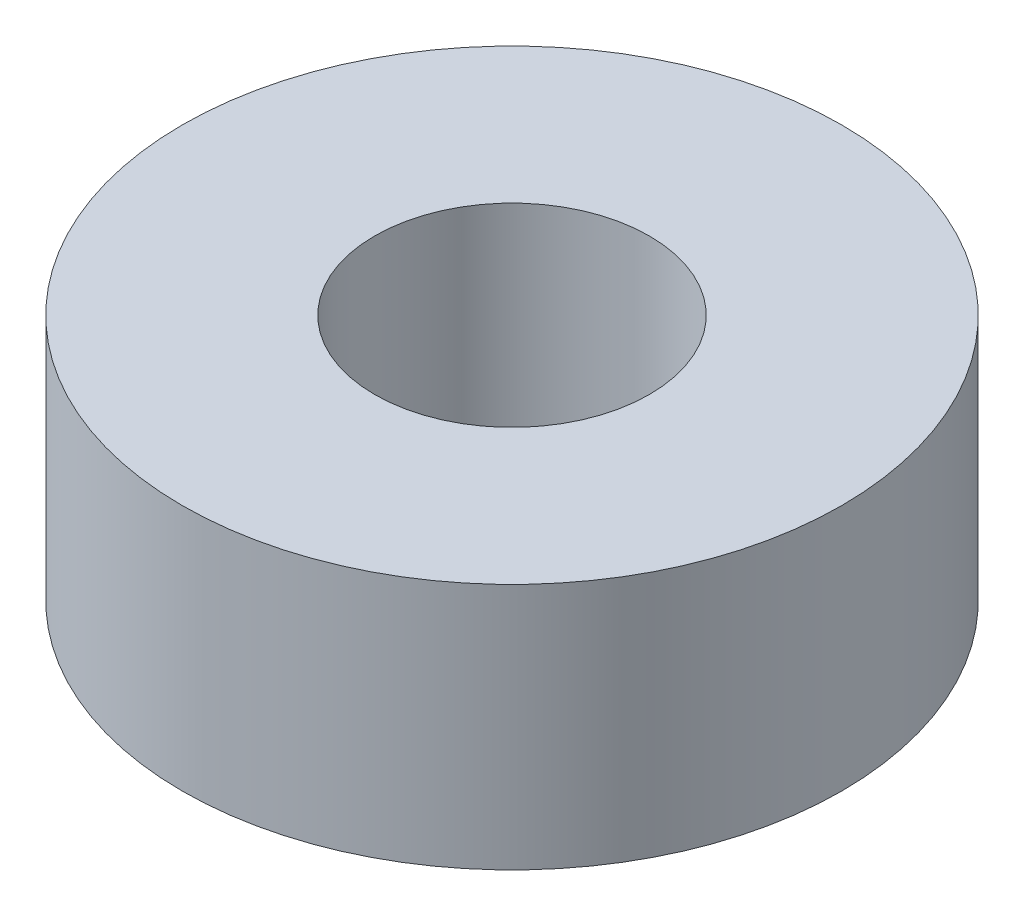
ISO-10303-21;
HEADER;
FILE_DESCRIPTION(('STEP AP214'),'2;1');
FILE_NAME('part.step','',(''),(''),'','','');
FILE_SCHEMA(('AUTOMOTIVE_DESIGN { 1 0 10303 214 1 1 1 1 }'));
ENDSEC;
DATA;
#1=APPLICATION_CONTEXT('core data for automotive mechanical design processes');
#2=APPLICATION_PROTOCOL_DEFINITION('international standard','automotive_design',2000,#1);
#3=PRODUCT_CONTEXT('',#1,'mechanical');
#4=PRODUCT('Part','Part','',(#3));
#5=PRODUCT_RELATED_PRODUCT_CATEGORY('part','',(#4));
#6=PRODUCT_DEFINITION_FORMATION('','',#4);
#7=PRODUCT_DEFINITION_CONTEXT('part definition',#1,'design');
#8=PRODUCT_DEFINITION('design','',#6,#7);
#9=PRODUCT_DEFINITION_SHAPE('','',#8);
#10=(LENGTH_UNIT() NAMED_UNIT(*) SI_UNIT(.MILLI.,.METRE.));
#11=(NAMED_UNIT(*) PLANE_ANGLE_UNIT() SI_UNIT($,.RADIAN.));
#12=(NAMED_UNIT(*) SI_UNIT($,.STERADIAN.) SOLID_ANGLE_UNIT());
#13=UNCERTAINTY_MEASURE_WITH_UNIT(LENGTH_MEASURE(1.E-05),#10,'distance_accuracy_value','');
#14=(GEOMETRIC_REPRESENTATION_CONTEXT(3) GLOBAL_UNCERTAINTY_ASSIGNED_CONTEXT((#13)) GLOBAL_UNIT_ASSIGNED_CONTEXT((#10,
#11,#12)) REPRESENTATION_CONTEXT('',''));
#15=CARTESIAN_POINT('',(0.,0.,0.));
#16=DIRECTION('',(0.,0.,1.));
#17=DIRECTION('',(1.,0.,0.));
#18=AXIS2_PLACEMENT_3D('',#15,#16,#17);
#19=CARTESIAN_POINT('',(0.,9.,0.));
#20=DIRECTION('',(0.,1.,0.));
#21=DIRECTION('',(0.,0.,1.));
#22=AXIS2_PLACEMENT_3D('',#19,#20,#21);
#23=PLANE('',#22);
#24=CARTESIAN_POINT('',(0.,9.,0.));
#25=DIRECTION('',(0.,1.,0.));
#26=DIRECTION('',(0.,0.,1.));
#27=AXIS2_PLACEMENT_3D('',#24,#25,#26);
#28=CIRCLE('',#27,12.);
#29=CARTESIAN_POINT('',(0.,9.,12.));
#30=VERTEX_POINT('',#29);
#31=EDGE_CURVE('E10',#30,#30,#28,.T.);
#32=ORIENTED_EDGE('',*,*,#31,.T.);
#33=EDGE_LOOP('',(#32));
#34=FACE_BOUND('',#33,.T.);
#35=CARTESIAN_POINT('',(0.,9.,0.));
#36=DIRECTION('',(0.,1.,0.));
#37=DIRECTION('',(0.,0.,1.));
#38=AXIS2_PLACEMENT_3D('',#35,#36,#37);
#39=CIRCLE('',#38,5.);
#40=CARTESIAN_POINT('',(0.,9.,5.));
#41=VERTEX_POINT('',#40);
#42=EDGE_CURVE('E42',#41,#41,#39,.T.);
#43=ORIENTED_EDGE('',*,*,#42,.F.);
#44=EDGE_LOOP('',(#43));
#45=FACE_BOUND('',#44,.T.);
#46=ADVANCED_FACE('F31',(#34,#45),#23,.T.);
#47=CARTESIAN_POINT('',(0.,0.,0.));
#48=DIRECTION('',(0.,1.,0.));
#49=DIRECTION('',(0.,0.,1.));
#50=AXIS2_PLACEMENT_3D('',#47,#48,#49);
#51=PLANE('',#50);
#52=CARTESIAN_POINT('',(0.,0.,0.));
#53=DIRECTION('',(0.,1.,0.));
#54=DIRECTION('',(0.,0.,1.));
#55=AXIS2_PLACEMENT_3D('',#52,#53,#54);
#56=CIRCLE('',#55,12.);
#57=CARTESIAN_POINT('',(0.,0.,12.));
#58=VERTEX_POINT('',#57);
#59=EDGE_CURVE('E35',#58,#58,#56,.T.);
#60=ORIENTED_EDGE('',*,*,#59,.F.);
#61=EDGE_LOOP('',(#60));
#62=FACE_BOUND('',#61,.T.);
#63=CARTESIAN_POINT('',(0.,0.,0.));
#64=DIRECTION('',(0.,1.,0.));
#65=DIRECTION('',(0.,0.,1.));
#66=AXIS2_PLACEMENT_3D('',#63,#64,#65);
#67=CIRCLE('',#66,5.);
#68=CARTESIAN_POINT('',(0.,0.,5.));
#69=VERTEX_POINT('',#68);
#70=EDGE_CURVE('E44',#69,#69,#67,.T.);
#71=ORIENTED_EDGE('',*,*,#70,.T.);
#72=EDGE_LOOP('',(#71));
#73=FACE_BOUND('',#72,.T.);
#74=ADVANCED_FACE('F54',(#62,#73),#51,.F.);
#75=CARTESIAN_POINT('',(0.,9.,0.));
#76=DIRECTION('',(0.,-1.,0.));
#77=DIRECTION('',(0.,0.,-1.));
#78=AXIS2_PLACEMENT_3D('',#75,#76,#77);
#79=CYLINDRICAL_SURFACE('',#78,12.);
#80=ORIENTED_EDGE('',*,*,#31,.F.);
#81=EDGE_LOOP('',(#80));
#82=FACE_BOUND('',#81,.T.);
#83=ORIENTED_EDGE('',*,*,#59,.T.);
#84=EDGE_LOOP('',(#83));
#85=FACE_BOUND('',#84,.T.);
#86=ADVANCED_FACE('F33',(#82,#85),#79,.T.);
#87=CARTESIAN_POINT('',(0.,9.,0.));
#88=DIRECTION('',(0.,-1.,0.));
#89=DIRECTION('',(0.,0.,-1.));
#90=AXIS2_PLACEMENT_3D('',#87,#88,#89);
#91=CYLINDRICAL_SURFACE('',#90,5.);
#92=ORIENTED_EDGE('',*,*,#42,.T.);
#93=EDGE_LOOP('',(#92));
#94=FACE_BOUND('',#93,.T.);
#95=ORIENTED_EDGE('',*,*,#70,.F.);
#96=EDGE_LOOP('',(#95));
#97=FACE_BOUND('',#96,.T.);
#98=ADVANCED_FACE('F50',(#94,#97),#91,.F.);
#99=CLOSED_SHELL('',(#46,#74,#86,#98));
#100=MANIFOLD_SOLID_BREP('B2',#99);
#101=ADVANCED_BREP_SHAPE_REPRESENTATION('',(#18,#100),#14);
#102=SHAPE_DEFINITION_REPRESENTATION(#9,#101);
ENDSEC;
END-ISO-10303-21;
